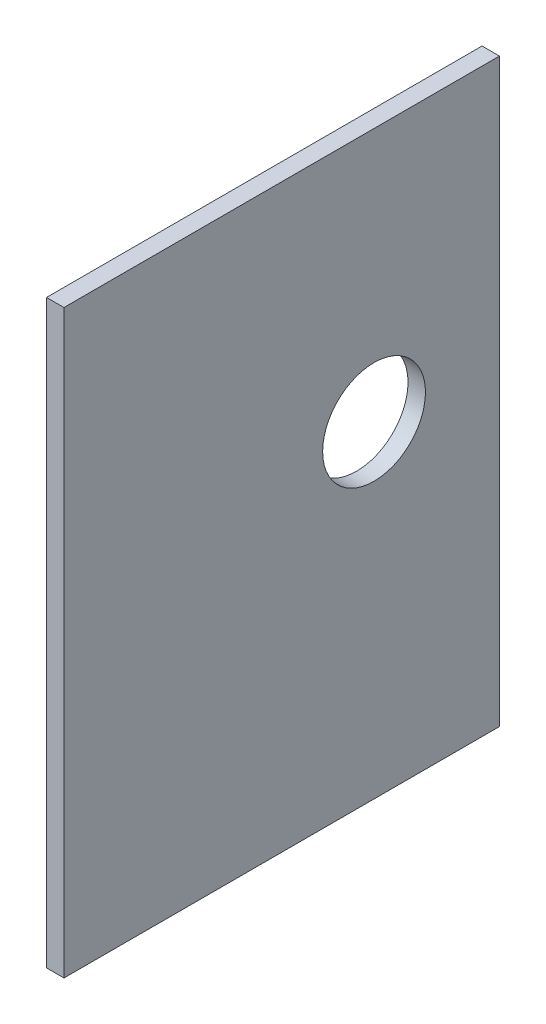
ISO-10303-21;
HEADER;
FILE_DESCRIPTION(('STEP AP214'),'2;1');
FILE_NAME('part.step','',(''),(''),'','','');
FILE_SCHEMA(('AUTOMOTIVE_DESIGN { 1 0 10303 214 1 1 1 1 }'));
ENDSEC;
DATA;
#1=APPLICATION_CONTEXT('core data for automotive mechanical design processes');
#2=APPLICATION_PROTOCOL_DEFINITION('international standard','automotive_design',2000,#1);
#3=PRODUCT_CONTEXT('',#1,'mechanical');
#4=PRODUCT('Part','Part','',(#3));
#5=PRODUCT_RELATED_PRODUCT_CATEGORY('part','',(#4));
#6=PRODUCT_DEFINITION_FORMATION('','',#4);
#7=PRODUCT_DEFINITION_CONTEXT('part definition',#1,'design');
#8=PRODUCT_DEFINITION('design','',#6,#7);
#9=PRODUCT_DEFINITION_SHAPE('','',#8);
#10=(LENGTH_UNIT() NAMED_UNIT(*) SI_UNIT(.MILLI.,.METRE.));
#11=(NAMED_UNIT(*) PLANE_ANGLE_UNIT() SI_UNIT($,.RADIAN.));
#12=(NAMED_UNIT(*) SI_UNIT($,.STERADIAN.) SOLID_ANGLE_UNIT());
#13=UNCERTAINTY_MEASURE_WITH_UNIT(LENGTH_MEASURE(1.E-05),#10,'distance_accuracy_value','');
#14=(GEOMETRIC_REPRESENTATION_CONTEXT(3) GLOBAL_UNCERTAINTY_ASSIGNED_CONTEXT((#13)) GLOBAL_UNIT_ASSIGNED_CONTEXT((#10,
#11,#12)) REPRESENTATION_CONTEXT('',''));
#15=CARTESIAN_POINT('',(0.,0.,0.));
#16=DIRECTION('',(0.,0.,1.));
#17=DIRECTION('',(1.,0.,0.));
#18=AXIS2_PLACEMENT_3D('',#15,#16,#17);
#19=CARTESIAN_POINT('',(7.62,0.,0.));
#20=DIRECTION('',(-1.,0.,0.));
#21=DIRECTION('',(0.,0.,1.));
#22=AXIS2_PLACEMENT_3D('',#19,#20,#21);
#23=PLANE('',#22);
#24=DIRECTION('',(0.,1.,0.));
#25=VECTOR('',#24,1.);
#26=CARTESIAN_POINT('',(7.62,-127.,-95.25));
#27=LINE('',#26,#25);
#28=CARTESIAN_POINT('',(7.62,-127.,-95.25));
#29=VERTEX_POINT('',#28);
#30=CARTESIAN_POINT('',(7.62,127.,-95.25));
#31=VERTEX_POINT('',#30);
#32=EDGE_CURVE('E85',#29,#31,#27,.T.);
#33=ORIENTED_EDGE('',*,*,#32,.T.);
#34=DIRECTION('',(0.,0.,1.));
#35=VECTOR('',#34,1.);
#36=CARTESIAN_POINT('',(7.62,127.,95.25));
#37=LINE('',#36,#35);
#38=CARTESIAN_POINT('',(7.62,127.,95.25));
#39=VERTEX_POINT('',#38);
#40=EDGE_CURVE('E80',#31,#39,#37,.T.);
#41=ORIENTED_EDGE('',*,*,#40,.T.);
#42=DIRECTION('',(0.,-1.,0.));
#43=VECTOR('',#42,1.);
#44=CARTESIAN_POINT('',(7.62,-127.,95.25));
#45=LINE('',#44,#43);
#46=CARTESIAN_POINT('',(7.62,-127.,95.25));
#47=VERTEX_POINT('',#46);
#48=EDGE_CURVE('E83',#39,#47,#45,.T.);
#49=ORIENTED_EDGE('',*,*,#48,.T.);
#50=DIRECTION('',(0.,0.,-1.));
#51=VECTOR('',#50,1.);
#52=CARTESIAN_POINT('',(7.62,-127.,95.25));
#53=LINE('',#52,#51);
#54=EDGE_CURVE('E50',#47,#29,#53,.T.);
#55=ORIENTED_EDGE('',*,*,#54,.T.);
#56=EDGE_LOOP('',(#33,#41,#49,#55));
#57=FACE_BOUND('',#56,.T.);
#58=CARTESIAN_POINT('',(7.62,15.8371257031718,-40.3863256898207));
#59=DIRECTION('',(1.,0.,0.));
#60=DIRECTION('',(0.,0.,-1.));
#61=AXIS2_PLACEMENT_3D('',#58,#59,#60);
#62=CIRCLE('',#61,22.479);
#63=CARTESIAN_POINT('',(7.62,15.8371257031718,-17.9073256898207));
#64=VERTEX_POINT('',#63);
#65=EDGE_CURVE('E100',#64,#64,#62,.T.);
#66=ORIENTED_EDGE('',*,*,#65,.F.);
#67=EDGE_LOOP('',(#66));
#68=FACE_BOUND('',#67,.T.);
#69=ADVANCED_FACE('F33',(#57,#68),#23,.F.);
#70=CARTESIAN_POINT('',(0.,0.,0.));
#71=DIRECTION('',(-1.,0.,0.));
#72=DIRECTION('',(0.,0.,1.));
#73=AXIS2_PLACEMENT_3D('',#70,#71,#72);
#74=PLANE('',#73);
#75=DIRECTION('',(0.,1.,0.));
#76=VECTOR('',#75,1.);
#77=CARTESIAN_POINT('',(0.,-127.,-95.25));
#78=LINE('',#77,#76);
#79=CARTESIAN_POINT('',(0.,-127.,-95.25));
#80=VERTEX_POINT('',#79);
#81=CARTESIAN_POINT('',(0.,127.,-95.25));
#82=VERTEX_POINT('',#81);
#83=EDGE_CURVE('E97',#80,#82,#78,.T.);
#84=ORIENTED_EDGE('',*,*,#83,.F.);
#85=DIRECTION('',(0.,0.,-1.));
#86=VECTOR('',#85,1.);
#87=CARTESIAN_POINT('',(0.,-127.,95.25));
#88=LINE('',#87,#86);
#89=CARTESIAN_POINT('',(0.,-127.,95.25));
#90=VERTEX_POINT('',#89);
#91=EDGE_CURVE('E73',#90,#80,#88,.T.);
#92=ORIENTED_EDGE('',*,*,#91,.F.);
#93=DIRECTION('',(0.,-1.,0.));
#94=VECTOR('',#93,1.);
#95=CARTESIAN_POINT('',(0.,-127.,95.25));
#96=LINE('',#95,#94);
#97=CARTESIAN_POINT('',(0.,127.,95.25));
#98=VERTEX_POINT('',#97);
#99=EDGE_CURVE('E67',#98,#90,#96,.T.);
#100=ORIENTED_EDGE('',*,*,#99,.F.);
#101=DIRECTION('',(0.,0.,1.));
#102=VECTOR('',#101,1.);
#103=CARTESIAN_POINT('',(0.,127.,95.25));
#104=LINE('',#103,#102);
#105=EDGE_CURVE('E89',#82,#98,#104,.T.);
#106=ORIENTED_EDGE('',*,*,#105,.F.);
#107=EDGE_LOOP('',(#84,#92,#100,#106));
#108=FACE_BOUND('',#107,.T.);
#109=CARTESIAN_POINT('',(0.,15.8371257031718,-40.3863256898207));
#110=DIRECTION('',(1.,0.,0.));
#111=DIRECTION('',(0.,0.,-1.));
#112=AXIS2_PLACEMENT_3D('',#109,#110,#111);
#113=CIRCLE('',#112,22.479);
#114=CARTESIAN_POINT('',(0.,15.8371257031718,-17.9073256898207));
#115=VERTEX_POINT('',#114);
#116=EDGE_CURVE('E112',#115,#115,#113,.T.);
#117=ORIENTED_EDGE('',*,*,#116,.T.);
#118=EDGE_LOOP('',(#117));
#119=FACE_BOUND('',#118,.T.);
#120=ADVANCED_FACE('F108',(#108,#119),#74,.T.);
#121=CARTESIAN_POINT('',(7.62,-127.,-95.25));
#122=DIRECTION('',(0.,0.,1.));
#123=DIRECTION('',(1.,0.,0.));
#124=AXIS2_PLACEMENT_3D('',#121,#122,#123);
#125=PLANE('',#124);
#126=ORIENTED_EDGE('',*,*,#83,.T.);
#127=DIRECTION('',(-1.,0.,0.));
#128=VECTOR('',#127,1.);
#129=CARTESIAN_POINT('',(7.62,127.,-95.25));
#130=LINE('',#129,#128);
#131=EDGE_CURVE('E11',#31,#82,#130,.T.);
#132=ORIENTED_EDGE('',*,*,#131,.F.);
#133=ORIENTED_EDGE('',*,*,#32,.F.);
#134=DIRECTION('',(-1.,0.,0.));
#135=VECTOR('',#134,1.);
#136=CARTESIAN_POINT('',(7.62,-127.,-95.25));
#137=LINE('',#136,#135);
#138=EDGE_CURVE('E93',#29,#80,#137,.T.);
#139=ORIENTED_EDGE('',*,*,#138,.T.);
#140=EDGE_LOOP('',(#126,#132,#133,#139));
#141=FACE_BOUND('',#140,.T.);
#142=ADVANCED_FACE('F35',(#141),#125,.F.);
#143=CARTESIAN_POINT('',(7.62,127.,95.25));
#144=DIRECTION('',(0.,-1.,0.));
#145=DIRECTION('',(0.,0.,-1.));
#146=AXIS2_PLACEMENT_3D('',#143,#144,#145);
#147=PLANE('',#146);
#148=ORIENTED_EDGE('',*,*,#105,.T.);
#149=DIRECTION('',(-1.,0.,0.));
#150=VECTOR('',#149,1.);
#151=CARTESIAN_POINT('',(7.62,127.,95.25));
#152=LINE('',#151,#150);
#153=EDGE_CURVE('E42',#39,#98,#152,.T.);
#154=ORIENTED_EDGE('',*,*,#153,.F.);
#155=ORIENTED_EDGE('',*,*,#40,.F.);
#156=ORIENTED_EDGE('',*,*,#131,.T.);
#157=EDGE_LOOP('',(#148,#154,#155,#156));
#158=FACE_BOUND('',#157,.T.);
#159=ADVANCED_FACE('F88',(#158),#147,.F.);
#160=CARTESIAN_POINT('',(7.62,-127.,95.25));
#161=DIRECTION('',(0.,0.,-1.));
#162=DIRECTION('',(-1.,0.,0.));
#163=AXIS2_PLACEMENT_3D('',#160,#161,#162);
#164=PLANE('',#163);
#165=ORIENTED_EDGE('',*,*,#99,.T.);
#166=DIRECTION('',(-1.,0.,0.));
#167=VECTOR('',#166,1.);
#168=CARTESIAN_POINT('',(7.62,-127.,95.25));
#169=LINE('',#168,#167);
#170=EDGE_CURVE('E90',#47,#90,#169,.T.);
#171=ORIENTED_EDGE('',*,*,#170,.F.);
#172=ORIENTED_EDGE('',*,*,#48,.F.);
#173=ORIENTED_EDGE('',*,*,#153,.T.);
#174=EDGE_LOOP('',(#165,#171,#172,#173));
#175=FACE_BOUND('',#174,.T.);
#176=ADVANCED_FACE('F91',(#175),#164,.F.);
#177=CARTESIAN_POINT('',(7.62,-127.,95.25));
#178=DIRECTION('',(0.,1.,0.));
#179=DIRECTION('',(0.,0.,1.));
#180=AXIS2_PLACEMENT_3D('',#177,#178,#179);
#181=PLANE('',#180);
#182=ORIENTED_EDGE('',*,*,#91,.T.);
#183=ORIENTED_EDGE('',*,*,#138,.F.);
#184=ORIENTED_EDGE('',*,*,#54,.F.);
#185=ORIENTED_EDGE('',*,*,#170,.T.);
#186=EDGE_LOOP('',(#182,#183,#184,#185));
#187=FACE_BOUND('',#186,.T.);
#188=ADVANCED_FACE('F105',(#187),#181,.F.);
#189=CARTESIAN_POINT('',(7.62,15.8371257031718,-40.3863256898207));
#190=DIRECTION('',(-1.,0.,0.));
#191=DIRECTION('',(0.,0.,1.));
#192=AXIS2_PLACEMENT_3D('',#189,#190,#191);
#193=CYLINDRICAL_SURFACE('',#192,22.479);
#194=CARTESIAN_POINT('',(7.62,15.8371257031718,-17.9073256898207));
#195=CARTESIAN_POINT('',(7.540625,15.8371257031718,-17.9073256898207));
#196=CARTESIAN_POINT('',(7.46125,15.8371257031718,-17.9073256898207));
#197=CARTESIAN_POINT('',(7.3025,15.8371257031718,-17.9073256898207));
#198=CARTESIAN_POINT('',(7.223125,15.8371257031718,-17.9073256898207));
#199=CARTESIAN_POINT('',(7.064375,15.8371257031718,-17.9073256898207));
#200=CARTESIAN_POINT('',(6.985,15.8371257031718,-17.9073256898207));
#201=CARTESIAN_POINT('',(6.82625,15.8371257031718,-17.9073256898207));
#202=CARTESIAN_POINT('',(6.746875,15.8371257031718,-17.9073256898207));
#203=CARTESIAN_POINT('',(6.588125,15.8371257031718,-17.9073256898207));
#204=CARTESIAN_POINT('',(6.50875,15.8371257031718,-17.9073256898207));
#205=CARTESIAN_POINT('',(6.35,15.8371257031718,-17.9073256898207));
#206=CARTESIAN_POINT('',(6.270625,15.8371257031718,-17.9073256898207));
#207=CARTESIAN_POINT('',(6.111875,15.8371257031718,-17.9073256898207));
#208=CARTESIAN_POINT('',(6.0325,15.8371257031718,-17.9073256898207));
#209=CARTESIAN_POINT('',(5.87375,15.8371257031718,-17.9073256898207));
#210=CARTESIAN_POINT('',(5.794375,15.8371257031718,-17.9073256898207));
#211=CARTESIAN_POINT('',(5.635625,15.8371257031718,-17.9073256898207));
#212=CARTESIAN_POINT('',(5.55625,15.8371257031718,-17.9073256898207));
#213=CARTESIAN_POINT('',(5.3975,15.8371257031718,-17.9073256898207));
#214=CARTESIAN_POINT('',(5.318125,15.8371257031718,-17.9073256898207));
#215=CARTESIAN_POINT('',(5.159375,15.8371257031718,-17.9073256898207));
#216=CARTESIAN_POINT('',(5.08,15.8371257031718,-17.9073256898207));
#217=CARTESIAN_POINT('',(4.92125,15.8371257031718,-17.9073256898207));
#218=CARTESIAN_POINT('',(4.841875,15.8371257031718,-17.9073256898207));
#219=CARTESIAN_POINT('',(4.683125,15.8371257031718,-17.9073256898207));
#220=CARTESIAN_POINT('',(4.60375,15.8371257031718,-17.9073256898207));
#221=CARTESIAN_POINT('',(4.445,15.8371257031718,-17.9073256898207));
#222=CARTESIAN_POINT('',(4.365625,15.8371257031718,-17.9073256898207));
#223=CARTESIAN_POINT('',(4.206875,15.8371257031718,-17.9073256898207));
#224=CARTESIAN_POINT('',(4.1275,15.8371257031718,-17.9073256898207));
#225=CARTESIAN_POINT('',(3.96875,15.8371257031718,-17.9073256898207));
#226=CARTESIAN_POINT('',(3.889375,15.8371257031718,-17.9073256898207));
#227=CARTESIAN_POINT('',(3.730625,15.8371257031718,-17.9073256898207));
#228=CARTESIAN_POINT('',(3.65125,15.8371257031718,-17.9073256898207));
#229=CARTESIAN_POINT('',(3.4925,15.8371257031718,-17.9073256898207));
#230=CARTESIAN_POINT('',(3.413125,15.8371257031718,-17.9073256898207));
#231=CARTESIAN_POINT('',(3.254375,15.8371257031718,-17.9073256898207));
#232=CARTESIAN_POINT('',(3.175,15.8371257031718,-17.9073256898207));
#233=CARTESIAN_POINT('',(3.01625,15.8371257031718,-17.9073256898207));
#234=CARTESIAN_POINT('',(2.936875,15.8371257031718,-17.9073256898207));
#235=CARTESIAN_POINT('',(2.778125,15.8371257031718,-17.9073256898207));
#236=CARTESIAN_POINT('',(2.69875,15.8371257031718,-17.9073256898207));
#237=CARTESIAN_POINT('',(2.54,15.8371257031718,-17.9073256898207));
#238=CARTESIAN_POINT('',(2.460625,15.8371257031718,-17.9073256898207));
#239=CARTESIAN_POINT('',(2.301875,15.8371257031718,-17.9073256898207));
#240=CARTESIAN_POINT('',(2.2225,15.8371257031718,-17.9073256898207));
#241=CARTESIAN_POINT('',(2.06375,15.8371257031718,-17.9073256898207));
#242=CARTESIAN_POINT('',(1.984375,15.8371257031718,-17.9073256898207));
#243=CARTESIAN_POINT('',(1.825625,15.8371257031718,-17.9073256898207));
#244=CARTESIAN_POINT('',(1.74625,15.8371257031718,-17.9073256898207));
#245=CARTESIAN_POINT('',(1.5875,15.8371257031718,-17.9073256898207));
#246=CARTESIAN_POINT('',(1.508125,15.8371257031718,-17.9073256898207));
#247=CARTESIAN_POINT('',(1.349375,15.8371257031718,-17.9073256898207));
#248=CARTESIAN_POINT('',(1.27,15.8371257031718,-17.9073256898207));
#249=CARTESIAN_POINT('',(1.11125,15.8371257031718,-17.9073256898207));
#250=CARTESIAN_POINT('',(1.031875,15.8371257031718,-17.9073256898207));
#251=CARTESIAN_POINT('',(0.873125,15.8371257031718,-17.9073256898207));
#252=CARTESIAN_POINT('',(0.79375,15.8371257031718,-17.9073256898207));
#253=CARTESIAN_POINT('',(0.635,15.8371257031718,-17.9073256898207));
#254=CARTESIAN_POINT('',(0.555625,15.8371257031718,-17.9073256898207));
#255=CARTESIAN_POINT('',(0.396875,15.8371257031718,-17.9073256898207));
#256=CARTESIAN_POINT('',(0.3175,15.8371257031718,-17.9073256898207));
#257=CARTESIAN_POINT('',(0.15875,15.8371257031718,-17.9073256898207));
#258=CARTESIAN_POINT('',(0.0793749999999999,15.8371257031718,-17.9073256898207));
#259=CARTESIAN_POINT('',(0.,15.8371257031718,-17.9073256898207));
#260=B_SPLINE_CURVE_WITH_KNOTS('',3,(#194,#195,#196,#197,#198,#199,#200,#201,#202,#203,#204,
#205,#206,#207,#208,#209,#210,#211,#212,#213,#214,#215,#216,#217,#218,#219,#220,#221,#222,#223,
#224,#225,#226,#227,#228,#229,#230,#231,#232,#233,#234,#235,#236,#237,#238,#239,#240,#241,#242,
#243,#244,#245,#246,#247,#248,#249,#250,#251,#252,#253,#254,#255,#256,#257,#258,#259),
.UNSPECIFIED.,.F.,.F.,(4,2,2,2,2,2,2,2,2,2,2,2,2,2,2,2,2,2,2,2,2,2,2,2,2,2,2,2,2,2,2,2,4),(0.,
0.238125,0.47625,0.714375000000001,0.9525,1.190625,1.42875,1.666875,1.905,2.143125,2.38125,
2.619375,2.8575,3.095625,3.33375,3.571875,3.81,4.048125,4.28625,4.524375,4.7625,5.000625,
5.23875,5.476875,5.715,5.953125,6.19125,6.429375,6.6675,6.905625,7.14375,7.381875,7.62),.UNSPECIFIED.);
#261=EDGE_CURVE('BSEAM118',#64,#115,#260,.T.);
#262=ORIENTED_EDGE('',*,*,#65,.T.);
#263=ORIENTED_EDGE('',*,*,#116,.F.);
#264=ORIENTED_EDGE('',*,*,#261,.T.);
#265=ORIENTED_EDGE('',*,*,#261,.F.);
#266=EDGE_LOOP('',(#262,#264,#263,#265));
#267=FACE_BOUND('',#266,.T.);
#268=ADVANCED_FACE('F118',(#267),#193,.F.);
#269=CLOSED_SHELL('',(#69,#120,#142,#159,#176,#188,#268));
#270=MANIFOLD_SOLID_BREP('B2',#269);
#271=ADVANCED_BREP_SHAPE_REPRESENTATION('',(#18,#270),#14);
#272=SHAPE_DEFINITION_REPRESENTATION(#9,#271);
ENDSEC;
END-ISO-10303-21;
